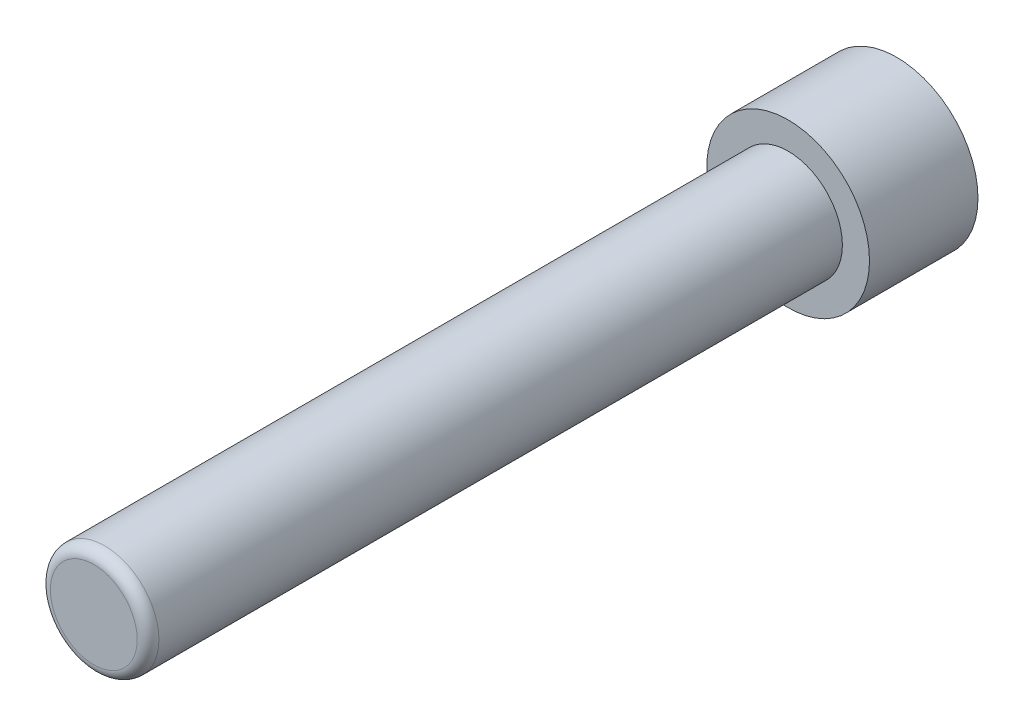
ISO-10303-21;
HEADER;
FILE_DESCRIPTION(('STEP AP214'),'2;1');
FILE_NAME('part.step','',(''),(''),'','','');
FILE_SCHEMA(('AUTOMOTIVE_DESIGN { 1 0 10303 214 1 1 1 1 }'));
ENDSEC;
DATA;
#1=APPLICATION_CONTEXT('core data for automotive mechanical design processes');
#2=APPLICATION_PROTOCOL_DEFINITION('international standard','automotive_design',2000,#1);
#3=PRODUCT_CONTEXT('',#1,'mechanical');
#4=PRODUCT('Part','Part','',(#3));
#5=PRODUCT_RELATED_PRODUCT_CATEGORY('part','',(#4));
#6=PRODUCT_DEFINITION_FORMATION('','',#4);
#7=PRODUCT_DEFINITION_CONTEXT('part definition',#1,'design');
#8=PRODUCT_DEFINITION('design','',#6,#7);
#9=PRODUCT_DEFINITION_SHAPE('','',#8);
#10=(LENGTH_UNIT() NAMED_UNIT(*) SI_UNIT(.MILLI.,.METRE.));
#11=(NAMED_UNIT(*) PLANE_ANGLE_UNIT() SI_UNIT($,.RADIAN.));
#12=(NAMED_UNIT(*) SI_UNIT($,.STERADIAN.) SOLID_ANGLE_UNIT());
#13=UNCERTAINTY_MEASURE_WITH_UNIT(LENGTH_MEASURE(1.E-05),#10,'distance_accuracy_value','');
#14=(GEOMETRIC_REPRESENTATION_CONTEXT(3) GLOBAL_UNCERTAINTY_ASSIGNED_CONTEXT((#13)) GLOBAL_UNIT_ASSIGNED_CONTEXT((#10,
#11,#12)) REPRESENTATION_CONTEXT('',''));
#15=CARTESIAN_POINT('',(0.,0.,0.));
#16=DIRECTION('',(0.,0.,1.));
#17=DIRECTION('',(1.,0.,0.));
#18=AXIS2_PLACEMENT_3D('',#15,#16,#17);
#19=CARTESIAN_POINT('',(0.,0.,5.08));
#20=DIRECTION('',(0.,0.,1.));
#21=DIRECTION('',(1.,0.,0.));
#22=AXIS2_PLACEMENT_3D('',#19,#20,#21);
#23=PLANE('',#22);
#24=CARTESIAN_POINT('',(0.,0.,5.08));
#25=DIRECTION('',(0.,0.,1.));
#26=DIRECTION('',(1.,0.,0.));
#27=AXIS2_PLACEMENT_3D('',#24,#25,#26);
#28=CIRCLE('',#27,3.81);
#29=CARTESIAN_POINT('',(3.81,0.,5.08));
#30=VERTEX_POINT('',#29);
#31=EDGE_CURVE('E122',#30,#30,#28,.T.);
#32=ORIENTED_EDGE('',*,*,#31,.T.);
#33=EDGE_LOOP('',(#32));
#34=FACE_BOUND('',#33,.T.);
#35=CARTESIAN_POINT('',(0.,0.,5.08));
#36=DIRECTION('',(0.,0.,1.));
#37=DIRECTION('',(1.,0.,0.));
#38=AXIS2_PLACEMENT_3D('',#35,#36,#37);
#39=CIRCLE('',#38,2.54);
#40=CARTESIAN_POINT('',(2.54,0.,5.08));
#41=VERTEX_POINT('',#40);
#42=EDGE_CURVE('E256',#41,#41,#39,.T.);
#43=ORIENTED_EDGE('',*,*,#42,.F.);
#44=EDGE_LOOP('',(#43));
#45=FACE_BOUND('',#44,.T.);
#46=ADVANCED_FACE('F32',(#34,#45),#23,.T.);
#47=CARTESIAN_POINT('',(0.,0.,0.));
#48=DIRECTION('',(0.,0.,1.));
#49=DIRECTION('',(1.,0.,0.));
#50=AXIS2_PLACEMENT_3D('',#47,#48,#49);
#51=PLANE('',#50);
#52=CARTESIAN_POINT('',(0.,0.,0.));
#53=DIRECTION('',(0.,0.,1.));
#54=DIRECTION('',(1.,0.,0.));
#55=AXIS2_PLACEMENT_3D('',#52,#53,#54);
#56=CIRCLE('',#55,3.81);
#57=CARTESIAN_POINT('',(3.81,0.,0.));
#58=VERTEX_POINT('',#57);
#59=EDGE_CURVE('E121',#58,#58,#56,.T.);
#60=ORIENTED_EDGE('',*,*,#59,.F.);
#61=EDGE_LOOP('',(#60));
#62=FACE_BOUND('',#61,.T.);
#63=DIRECTION('',(0.,1.,0.));
#64=VECTOR('',#63,1.);
#65=CARTESIAN_POINT('',(1.905,-1.09985226280624,0.));
#66=LINE('',#65,#64);
#67=CARTESIAN_POINT('',(1.905,-1.09985226280624,0.));
#68=VERTEX_POINT('',#67);
#69=CARTESIAN_POINT('',(1.905,1.09985226280624,0.));
#70=VERTEX_POINT('',#69);
#71=EDGE_CURVE('E47',#68,#70,#66,.T.);
#72=ORIENTED_EDGE('',*,*,#71,.T.);
#73=DIRECTION('',(-0.866025403784439,0.5,0.));
#74=VECTOR('',#73,1.);
#75=CARTESIAN_POINT('',(1.905,1.09985226280624,0.));
#76=LINE('',#75,#74);
#77=CARTESIAN_POINT('',(0.,2.19970452561247,0.));
#78=VERTEX_POINT('',#77);
#79=EDGE_CURVE('E107',#70,#78,#76,.T.);
#80=ORIENTED_EDGE('',*,*,#79,.T.);
#81=DIRECTION('',(-0.866025403784439,-0.5,0.));
#82=VECTOR('',#81,1.);
#83=CARTESIAN_POINT('',(0.,2.19970452561247,0.));
#84=LINE('',#83,#82);
#85=CARTESIAN_POINT('',(-1.905,1.09985226280624,0.));
#86=VERTEX_POINT('',#85);
#87=EDGE_CURVE('E105',#78,#86,#84,.T.);
#88=ORIENTED_EDGE('',*,*,#87,.T.);
#89=DIRECTION('',(0.,-1.,0.));
#90=VECTOR('',#89,1.);
#91=CARTESIAN_POINT('',(-1.905,1.09985226280624,0.));
#92=LINE('',#91,#90);
#93=CARTESIAN_POINT('',(-1.905,-1.09985226280624,0.));
#94=VERTEX_POINT('',#93);
#95=EDGE_CURVE('E83',#86,#94,#92,.T.);
#96=ORIENTED_EDGE('',*,*,#95,.T.);
#97=DIRECTION('',(0.866025403784439,-0.5,0.));
#98=VECTOR('',#97,1.);
#99=CARTESIAN_POINT('',(-1.905,-1.09985226280624,0.));
#100=LINE('',#99,#98);
#101=CARTESIAN_POINT('',(0.,-2.19970452561247,0.));
#102=VERTEX_POINT('',#101);
#103=EDGE_CURVE('E94',#94,#102,#100,.T.);
#104=ORIENTED_EDGE('',*,*,#103,.T.);
#105=DIRECTION('',(0.866025403784439,0.5,0.));
#106=VECTOR('',#105,1.);
#107=CARTESIAN_POINT('',(0.,-2.19970452561247,0.));
#108=LINE('',#107,#106);
#109=EDGE_CURVE('E100',#102,#68,#108,.T.);
#110=ORIENTED_EDGE('',*,*,#109,.T.);
#111=EDGE_LOOP('',(#72,#80,#88,#96,#104,#110));
#112=FACE_BOUND('',#111,.T.);
#113=ADVANCED_FACE('F102',(#62,#112),#51,.F.);
#114=CARTESIAN_POINT('',(0.,0.,5.08));
#115=DIRECTION('',(0.,0.,-1.));
#116=DIRECTION('',(-1.,0.,0.));
#117=AXIS2_PLACEMENT_3D('',#114,#115,#116);
#118=CYLINDRICAL_SURFACE('',#117,3.81);
#119=ORIENTED_EDGE('',*,*,#31,.F.);
#120=EDGE_LOOP('',(#119));
#121=FACE_BOUND('',#120,.T.);
#122=ORIENTED_EDGE('',*,*,#59,.T.);
#123=EDGE_LOOP('',(#122));
#124=FACE_BOUND('',#123,.T.);
#125=ADVANCED_FACE('F145',(#121,#124),#118,.T.);
#126=CARTESIAN_POINT('',(1.905,-1.09985226280624,5.08));
#127=DIRECTION('',(-1.,0.,0.));
#128=DIRECTION('',(0.,-1.,0.));
#129=AXIS2_PLACEMENT_3D('',#126,#127,#128);
#130=PLANE('',#129);
#131=ORIENTED_EDGE('',*,*,#71,.F.);
#132=DIRECTION('',(0.,0.,-1.));
#133=VECTOR('',#132,1.);
#134=CARTESIAN_POINT('',(1.905,-1.09985226280624,5.08));
#135=LINE('',#134,#133);
#136=CARTESIAN_POINT('',(1.905,-1.09985226280624,5.08));
#137=VERTEX_POINT('',#136);
#138=EDGE_CURVE('E112',#137,#68,#135,.T.);
#139=ORIENTED_EDGE('',*,*,#138,.F.);
#140=DIRECTION('',(0.,1.,0.));
#141=VECTOR('',#140,1.);
#142=CARTESIAN_POINT('',(1.905,-1.09985226280624,5.08));
#143=LINE('',#142,#141);
#144=CARTESIAN_POINT('',(1.905,1.09985226280624,5.08));
#145=VERTEX_POINT('',#144);
#146=EDGE_CURVE('E56',#137,#145,#143,.T.);
#147=ORIENTED_EDGE('',*,*,#146,.T.);
#148=DIRECTION('',(0.,0.,-1.));
#149=VECTOR('',#148,1.);
#150=CARTESIAN_POINT('',(1.905,1.09985226280624,5.08));
#151=LINE('',#150,#149);
#152=EDGE_CURVE('E119',#145,#70,#151,.T.);
#153=ORIENTED_EDGE('',*,*,#152,.T.);
#154=EDGE_LOOP('',(#131,#139,#147,#153));
#155=FACE_BOUND('',#154,.T.);
#156=ADVANCED_FACE('F150',(#155),#130,.T.);
#157=CARTESIAN_POINT('',(1.905,1.09985226280624,5.08));
#158=DIRECTION('',(-0.5,-0.866025403784439,0.));
#159=DIRECTION('',(0.866025403784439,-0.5,0.));
#160=AXIS2_PLACEMENT_3D('',#157,#158,#159);
#161=PLANE('',#160);
#162=ORIENTED_EDGE('',*,*,#79,.F.);
#163=ORIENTED_EDGE('',*,*,#152,.F.);
#164=DIRECTION('',(-0.866025403784439,0.5,0.));
#165=VECTOR('',#164,1.);
#166=CARTESIAN_POINT('',(1.905,1.09985226280624,5.08));
#167=LINE('',#166,#165);
#168=CARTESIAN_POINT('',(0.,2.19970452561247,5.08));
#169=VERTEX_POINT('',#168);
#170=EDGE_CURVE('E261',#145,#169,#167,.T.);
#171=ORIENTED_EDGE('',*,*,#170,.T.);
#172=DIRECTION('',(0.,0.,-1.));
#173=VECTOR('',#172,1.);
#174=CARTESIAN_POINT('',(0.,2.19970452561247,5.08));
#175=LINE('',#174,#173);
#176=EDGE_CURVE('E117',#169,#78,#175,.T.);
#177=ORIENTED_EDGE('',*,*,#176,.T.);
#178=EDGE_LOOP('',(#162,#163,#171,#177));
#179=FACE_BOUND('',#178,.T.);
#180=ADVANCED_FACE('F157',(#179),#161,.T.);
#181=CARTESIAN_POINT('',(0.,2.19970452561247,5.08));
#182=DIRECTION('',(0.5,-0.866025403784439,0.));
#183=DIRECTION('',(0.866025403784439,0.5,0.));
#184=AXIS2_PLACEMENT_3D('',#181,#182,#183);
#185=PLANE('',#184);
#186=ORIENTED_EDGE('',*,*,#87,.F.);
#187=ORIENTED_EDGE('',*,*,#176,.F.);
#188=DIRECTION('',(-0.866025403784439,-0.5,0.));
#189=VECTOR('',#188,1.);
#190=CARTESIAN_POINT('',(0.,2.19970452561247,5.08));
#191=LINE('',#190,#189);
#192=CARTESIAN_POINT('',(-1.905,1.09985226280624,5.08));
#193=VERTEX_POINT('',#192);
#194=EDGE_CURVE('E264',#169,#193,#191,.T.);
#195=ORIENTED_EDGE('',*,*,#194,.T.);
#196=DIRECTION('',(0.,0.,-1.));
#197=VECTOR('',#196,1.);
#198=CARTESIAN_POINT('',(-1.905,1.09985226280624,5.08));
#199=LINE('',#198,#197);
#200=EDGE_CURVE('E90',#193,#86,#199,.T.);
#201=ORIENTED_EDGE('',*,*,#200,.T.);
#202=EDGE_LOOP('',(#186,#187,#195,#201));
#203=FACE_BOUND('',#202,.T.);
#204=ADVANCED_FACE('F164',(#203),#185,.T.);
#205=CARTESIAN_POINT('',(-1.905,1.09985226280624,5.08));
#206=DIRECTION('',(1.,0.,0.));
#207=DIRECTION('',(0.,1.,0.));
#208=AXIS2_PLACEMENT_3D('',#205,#206,#207);
#209=PLANE('',#208);
#210=ORIENTED_EDGE('',*,*,#95,.F.);
#211=ORIENTED_EDGE('',*,*,#200,.F.);
#212=DIRECTION('',(0.,-1.,0.));
#213=VECTOR('',#212,1.);
#214=CARTESIAN_POINT('',(-1.905,1.09985226280624,5.08));
#215=LINE('',#214,#213);
#216=CARTESIAN_POINT('',(-1.905,-1.09985226280624,5.08));
#217=VERTEX_POINT('',#216);
#218=EDGE_CURVE('E87',#193,#217,#215,.T.);
#219=ORIENTED_EDGE('',*,*,#218,.T.);
#220=DIRECTION('',(0.,0.,-1.));
#221=VECTOR('',#220,1.);
#222=CARTESIAN_POINT('',(-1.905,-1.09985226280624,5.08));
#223=LINE('',#222,#221);
#224=EDGE_CURVE('E78',#217,#94,#223,.T.);
#225=ORIENTED_EDGE('',*,*,#224,.T.);
#226=EDGE_LOOP('',(#210,#211,#219,#225));
#227=FACE_BOUND('',#226,.T.);
#228=ADVANCED_FACE('F80',(#227),#209,.T.);
#229=CARTESIAN_POINT('',(-1.905,-1.09985226280624,5.08));
#230=DIRECTION('',(0.5,0.866025403784439,0.));
#231=DIRECTION('',(-0.866025403784439,0.5,0.));
#232=AXIS2_PLACEMENT_3D('',#229,#230,#231);
#233=PLANE('',#232);
#234=ORIENTED_EDGE('',*,*,#103,.F.);
#235=ORIENTED_EDGE('',*,*,#224,.F.);
#236=DIRECTION('',(0.866025403784439,-0.5,0.));
#237=VECTOR('',#236,1.);
#238=CARTESIAN_POINT('',(-1.905,-1.09985226280624,5.08));
#239=LINE('',#238,#237);
#240=CARTESIAN_POINT('',(0.,-2.19970452561247,5.08));
#241=VERTEX_POINT('',#240);
#242=EDGE_CURVE('E268',#217,#241,#239,.T.);
#243=ORIENTED_EDGE('',*,*,#242,.T.);
#244=DIRECTION('',(0.,0.,-1.));
#245=VECTOR('',#244,1.);
#246=CARTESIAN_POINT('',(0.,-2.19970452561247,5.08));
#247=LINE('',#246,#245);
#248=EDGE_CURVE('E91',#241,#102,#247,.T.);
#249=ORIENTED_EDGE('',*,*,#248,.T.);
#250=EDGE_LOOP('',(#234,#235,#243,#249));
#251=FACE_BOUND('',#250,.T.);
#252=ADVANCED_FACE('F95',(#251),#233,.T.);
#253=CARTESIAN_POINT('',(0.,-2.19970452561247,5.08));
#254=DIRECTION('',(-0.5,0.866025403784439,0.));
#255=DIRECTION('',(-0.866025403784439,-0.5,0.));
#256=AXIS2_PLACEMENT_3D('',#253,#254,#255);
#257=PLANE('',#256);
#258=ORIENTED_EDGE('',*,*,#109,.F.);
#259=ORIENTED_EDGE('',*,*,#248,.F.);
#260=DIRECTION('',(0.866025403784439,0.5,0.));
#261=VECTOR('',#260,1.);
#262=CARTESIAN_POINT('',(0.,-2.19970452561247,5.08));
#263=LINE('',#262,#261);
#264=EDGE_CURVE('E114',#241,#137,#263,.T.);
#265=ORIENTED_EDGE('',*,*,#264,.T.);
#266=ORIENTED_EDGE('',*,*,#138,.T.);
#267=EDGE_LOOP('',(#258,#259,#265,#266));
#268=FACE_BOUND('',#267,.T.);
#269=ADVANCED_FACE('F176',(#268),#257,.T.);
#270=CARTESIAN_POINT('',(0.,0.,5.08));
#271=DIRECTION('',(0.,0.,1.));
#272=DIRECTION('',(1.,0.,0.));
#273=AXIS2_PLACEMENT_3D('',#270,#271,#272);
#274=PLANE('',#273);
#275=ORIENTED_EDGE('',*,*,#146,.F.);
#276=ORIENTED_EDGE('',*,*,#264,.F.);
#277=ORIENTED_EDGE('',*,*,#242,.F.);
#278=ORIENTED_EDGE('',*,*,#218,.F.);
#279=ORIENTED_EDGE('',*,*,#194,.F.);
#280=ORIENTED_EDGE('',*,*,#170,.F.);
#281=EDGE_LOOP('',(#275,#276,#277,#278,#279,#280));
#282=FACE_BOUND('',#281,.T.);
#283=ADVANCED_FACE('F179',(#282),#274,.F.);
#284=CARTESIAN_POINT('',(0.,0.,37.592));
#285=DIRECTION('',(0.,0.,-1.));
#286=DIRECTION('',(-1.,0.,0.));
#287=AXIS2_PLACEMENT_3D('',#284,#285,#286);
#288=CYLINDRICAL_SURFACE('',#287,2.54);
#289=CARTESIAN_POINT('',(0.,0.,37.084));
#290=DIRECTION('',(0.,0.,1.));
#291=DIRECTION('',(1.,0.,0.));
#292=AXIS2_PLACEMENT_3D('',#289,#290,#291);
#293=CIRCLE('',#292,2.54);
#294=CARTESIAN_POINT('',(2.54,0.,37.084));
#295=VERTEX_POINT('',#294);
#296=EDGE_CURVE('E11',#295,#295,#293,.F.);
#297=ORIENTED_EDGE('',*,*,#296,.T.);
#298=EDGE_LOOP('',(#297));
#299=FACE_BOUND('',#298,.T.);
#300=ORIENTED_EDGE('',*,*,#42,.T.);
#301=EDGE_LOOP('',(#300));
#302=FACE_BOUND('',#301,.T.);
#303=ADVANCED_FACE('F136',(#299,#302),#288,.T.);
#304=CARTESIAN_POINT('',(0.,0.,37.592));
#305=DIRECTION('',(0.,0.,1.));
#306=DIRECTION('',(1.,0.,0.));
#307=AXIS2_PLACEMENT_3D('',#304,#305,#306);
#308=PLANE('',#307);
#309=CARTESIAN_POINT('',(0.,0.,37.592));
#310=DIRECTION('',(0.,0.,1.));
#311=DIRECTION('',(1.,0.,0.));
#312=AXIS2_PLACEMENT_3D('',#309,#310,#311);
#313=CIRCLE('',#312,2.032);
#314=CARTESIAN_POINT('',(2.032,0.,37.592));
#315=VERTEX_POINT('',#314);
#316=EDGE_CURVE('E40',#315,#315,#313,.T.);
#317=ORIENTED_EDGE('',*,*,#316,.T.);
#318=EDGE_LOOP('',(#317));
#319=FACE_BOUND('',#318,.T.);
#320=ADVANCED_FACE('F129',(#319),#308,.T.);
#321=CARTESIAN_POINT('',(0.,0.,37.084));
#322=DIRECTION('',(0.,0.,1.));
#323=DIRECTION('',(1.,0.,0.));
#324=AXIS2_PLACEMENT_3D('',#321,#322,#323);
#325=TOROIDAL_SURFACE('',#324,2.032,0.508);
#326=ORIENTED_EDGE('',*,*,#296,.F.);
#327=EDGE_LOOP('',(#326));
#328=FACE_BOUND('',#327,.T.);
#329=ORIENTED_EDGE('',*,*,#316,.F.);
#330=EDGE_LOOP('',(#329));
#331=FACE_BOUND('',#330,.T.);
#332=ADVANCED_FACE('F34',(#328,#331),#325,.T.);
#333=CLOSED_SHELL('',(#46,#113,#125,#156,#180,#204,#228,#252,#269,#283,#303,#320,#332));
#334=MANIFOLD_SOLID_BREP('B2',#333);
#335=ADVANCED_BREP_SHAPE_REPRESENTATION('',(#18,#334),#14);
#336=SHAPE_DEFINITION_REPRESENTATION(#9,#335);
ENDSEC;
END-ISO-10303-21;
